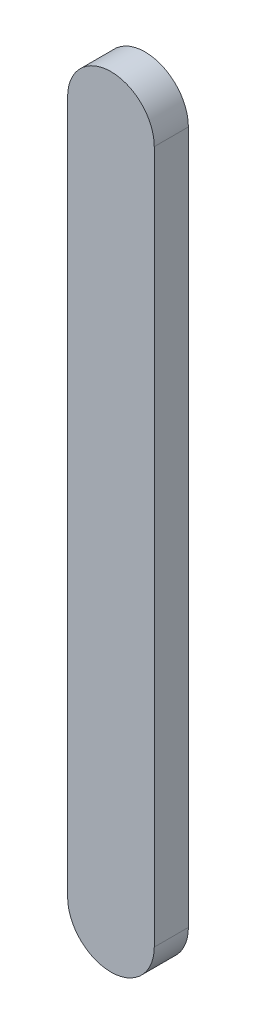
ISO-10303-21;
HEADER;
FILE_DESCRIPTION(('STEP AP214'),'2;1');
FILE_NAME('part.step','',(''),(''),'','','');
FILE_SCHEMA(('AUTOMOTIVE_DESIGN { 1 0 10303 214 1 1 1 1 }'));
ENDSEC;
DATA;
#1=APPLICATION_CONTEXT('core data for automotive mechanical design processes');
#2=APPLICATION_PROTOCOL_DEFINITION('international standard','automotive_design',2000,#1);
#3=PRODUCT_CONTEXT('',#1,'mechanical');
#4=PRODUCT('Part','Part','',(#3));
#5=PRODUCT_RELATED_PRODUCT_CATEGORY('part','',(#4));
#6=PRODUCT_DEFINITION_FORMATION('','',#4);
#7=PRODUCT_DEFINITION_CONTEXT('part definition',#1,'design');
#8=PRODUCT_DEFINITION('design','',#6,#7);
#9=PRODUCT_DEFINITION_SHAPE('','',#8);
#10=(LENGTH_UNIT() NAMED_UNIT(*) SI_UNIT(.MILLI.,.METRE.));
#11=(NAMED_UNIT(*) PLANE_ANGLE_UNIT() SI_UNIT($,.RADIAN.));
#12=(NAMED_UNIT(*) SI_UNIT($,.STERADIAN.) SOLID_ANGLE_UNIT());
#13=UNCERTAINTY_MEASURE_WITH_UNIT(LENGTH_MEASURE(1.E-05),#10,'distance_accuracy_value','');
#14=(GEOMETRIC_REPRESENTATION_CONTEXT(3) GLOBAL_UNCERTAINTY_ASSIGNED_CONTEXT((#13)) GLOBAL_UNIT_ASSIGNED_CONTEXT((#10,
#11,#12)) REPRESENTATION_CONTEXT('',''));
#15=CARTESIAN_POINT('',(0.,0.,0.));
#16=DIRECTION('',(0.,0.,1.));
#17=DIRECTION('',(1.,0.,0.));
#18=AXIS2_PLACEMENT_3D('',#15,#16,#17);
#19=CARTESIAN_POINT('',(88.519,109.474,0.));
#20=DIRECTION('',(-1.,0.,0.));
#21=DIRECTION('',(0.,1.,0.));
#22=AXIS2_PLACEMENT_3D('',#19,#20,#21);
#23=PLANE('',#22);
#24=DIRECTION('',(0.,1.,0.));
#25=VECTOR('',#24,1.);
#26=CARTESIAN_POINT('',(88.519,109.474,0.1999996));
#27=LINE('',#26,#25);
#28=CARTESIAN_POINT('',(88.519,109.474,0.1999996));
#29=VERTEX_POINT('',#28);
#30=CARTESIAN_POINT('',(88.519,113.538,0.1999996));
#31=VERTEX_POINT('',#30);
#32=EDGE_CURVE('E11',#29,#31,#27,.T.);
#33=ORIENTED_EDGE('',*,*,#32,.F.);
#34=DIRECTION('',(0.,0.,1.));
#35=VECTOR('',#34,1.);
#36=CARTESIAN_POINT('',(88.519,109.474,0.));
#37=LINE('',#36,#35);
#38=CARTESIAN_POINT('',(88.519,109.474,0.));
#39=VERTEX_POINT('',#38);
#40=EDGE_CURVE('E24',#39,#29,#37,.T.);
#41=ORIENTED_EDGE('',*,*,#40,.F.);
#42=DIRECTION('',(0.,1.,0.));
#43=VECTOR('',#42,1.);
#44=CARTESIAN_POINT('',(88.519,109.474,0.));
#45=LINE('',#44,#43);
#46=CARTESIAN_POINT('',(88.519,113.538,0.));
#47=VERTEX_POINT('',#46);
#48=EDGE_CURVE('E75',#39,#47,#45,.T.);
#49=ORIENTED_EDGE('',*,*,#48,.T.);
#50=DIRECTION('',(0.,0.,1.));
#51=VECTOR('',#50,1.);
#52=CARTESIAN_POINT('',(88.519,113.538,0.));
#53=LINE('',#52,#51);
#54=EDGE_CURVE('E37',#47,#31,#53,.T.);
#55=ORIENTED_EDGE('',*,*,#54,.T.);
#56=EDGE_LOOP('',(#33,#41,#49,#55));
#57=FACE_BOUND('',#56,.T.);
#58=ADVANCED_FACE('F17',(#57),#23,.F.);
#59=CARTESIAN_POINT('',(88.265,113.538,0.));
#60=DIRECTION('',(0.,0.,-1.));
#61=DIRECTION('',(1.,0.,0.));
#62=AXIS2_PLACEMENT_3D('',#59,#60,#61);
#63=CYLINDRICAL_SURFACE('',#62,0.254000000000005);
#64=CARTESIAN_POINT('',(88.265,113.538,0.1999996));
#65=DIRECTION('',(0.,0.,1.));
#66=DIRECTION('',(1.,0.,0.));
#67=AXIS2_PLACEMENT_3D('',#64,#65,#66);
#68=CIRCLE('',#67,0.254000000000005);
#69=CARTESIAN_POINT('',(88.011,113.538,0.1999996));
#70=VERTEX_POINT('',#69);
#71=EDGE_CURVE('E83',#31,#70,#68,.T.);
#72=ORIENTED_EDGE('',*,*,#71,.F.);
#73=ORIENTED_EDGE('',*,*,#54,.F.);
#74=CARTESIAN_POINT('',(88.265,113.538,0.));
#75=DIRECTION('',(0.,0.,1.));
#76=DIRECTION('',(1.,0.,0.));
#77=AXIS2_PLACEMENT_3D('',#74,#75,#76);
#78=CIRCLE('',#77,0.254000000000005);
#79=CARTESIAN_POINT('',(88.011,113.538,0.));
#80=VERTEX_POINT('',#79);
#81=EDGE_CURVE('E81',#47,#80,#78,.T.);
#82=ORIENTED_EDGE('',*,*,#81,.T.);
#83=DIRECTION('',(0.,0.,1.));
#84=VECTOR('',#83,1.);
#85=CARTESIAN_POINT('',(88.011,113.538,0.));
#86=LINE('',#85,#84);
#87=EDGE_CURVE('E67',#80,#70,#86,.T.);
#88=ORIENTED_EDGE('',*,*,#87,.T.);
#89=EDGE_LOOP('',(#72,#73,#82,#88));
#90=FACE_BOUND('',#89,.T.);
#91=ADVANCED_FACE('F89',(#90),#63,.T.);
#92=CARTESIAN_POINT('',(88.011,113.538,0.));
#93=DIRECTION('',(1.,0.,0.));
#94=DIRECTION('',(0.,-1.,0.));
#95=AXIS2_PLACEMENT_3D('',#92,#93,#94);
#96=PLANE('',#95);
#97=DIRECTION('',(0.,-1.,0.));
#98=VECTOR('',#97,1.);
#99=CARTESIAN_POINT('',(88.011,113.538,0.1999996));
#100=LINE('',#99,#98);
#101=CARTESIAN_POINT('',(88.011,109.474,0.1999996));
#102=VERTEX_POINT('',#101);
#103=EDGE_CURVE('E71',#70,#102,#100,.T.);
#104=ORIENTED_EDGE('',*,*,#103,.F.);
#105=ORIENTED_EDGE('',*,*,#87,.F.);
#106=DIRECTION('',(0.,-1.,0.));
#107=VECTOR('',#106,1.);
#108=CARTESIAN_POINT('',(88.011,113.538,0.));
#109=LINE('',#108,#107);
#110=CARTESIAN_POINT('',(88.011,109.474,0.));
#111=VERTEX_POINT('',#110);
#112=EDGE_CURVE('E63',#80,#111,#109,.T.);
#113=ORIENTED_EDGE('',*,*,#112,.T.);
#114=DIRECTION('',(0.,0.,1.));
#115=VECTOR('',#114,1.);
#116=CARTESIAN_POINT('',(88.011,109.474,0.));
#117=LINE('',#116,#115);
#118=EDGE_CURVE('E53',#111,#102,#117,.T.);
#119=ORIENTED_EDGE('',*,*,#118,.T.);
#120=EDGE_LOOP('',(#104,#105,#113,#119));
#121=FACE_BOUND('',#120,.T.);
#122=ADVANCED_FACE('F66',(#121),#96,.F.);
#123=CARTESIAN_POINT('',(88.265,109.474,0.));
#124=DIRECTION('',(0.,0.,-1.));
#125=DIRECTION('',(-1.,0.,0.));
#126=AXIS2_PLACEMENT_3D('',#123,#124,#125);
#127=CYLINDRICAL_SURFACE('',#126,0.254000000000005);
#128=CARTESIAN_POINT('',(88.265,109.474,0.1999996));
#129=DIRECTION('',(0.,0.,1.));
#130=DIRECTION('',(-1.,0.,0.));
#131=AXIS2_PLACEMENT_3D('',#128,#129,#130);
#132=CIRCLE('',#131,0.254000000000005);
#133=EDGE_CURVE('E59',#102,#29,#132,.T.);
#134=ORIENTED_EDGE('',*,*,#133,.F.);
#135=ORIENTED_EDGE('',*,*,#118,.F.);
#136=CARTESIAN_POINT('',(88.265,109.474,0.));
#137=DIRECTION('',(0.,0.,1.));
#138=DIRECTION('',(-1.,0.,0.));
#139=AXIS2_PLACEMENT_3D('',#136,#137,#138);
#140=CIRCLE('',#139,0.254000000000005);
#141=EDGE_CURVE('E57',#111,#39,#140,.T.);
#142=ORIENTED_EDGE('',*,*,#141,.T.);
#143=ORIENTED_EDGE('',*,*,#40,.T.);
#144=EDGE_LOOP('',(#134,#135,#142,#143));
#145=FACE_BOUND('',#144,.T.);
#146=ADVANCED_FACE('F55',(#145),#127,.T.);
#147=CARTESIAN_POINT('',(88.519,109.474,0.));
#148=DIRECTION('',(0.,0.,-1.));
#149=DIRECTION('',(-1.,0.,0.));
#150=AXIS2_PLACEMENT_3D('',#147,#148,#149);
#151=PLANE('',#150);
#152=ORIENTED_EDGE('',*,*,#141,.F.);
#153=ORIENTED_EDGE('',*,*,#112,.F.);
#154=ORIENTED_EDGE('',*,*,#81,.F.);
#155=ORIENTED_EDGE('',*,*,#48,.F.);
#156=EDGE_LOOP('',(#152,#153,#154,#155));
#157=FACE_BOUND('',#156,.T.);
#158=ADVANCED_FACE('F74',(#157),#151,.T.);
#159=CARTESIAN_POINT('',(88.519,109.474,0.1999996));
#160=DIRECTION('',(0.,0.,-1.));
#161=DIRECTION('',(-1.,0.,0.));
#162=AXIS2_PLACEMENT_3D('',#159,#160,#161);
#163=PLANE('',#162);
#164=ORIENTED_EDGE('',*,*,#32,.T.);
#165=ORIENTED_EDGE('',*,*,#71,.T.);
#166=ORIENTED_EDGE('',*,*,#103,.T.);
#167=ORIENTED_EDGE('',*,*,#133,.T.);
#168=EDGE_LOOP('',(#164,#165,#166,#167));
#169=FACE_BOUND('',#168,.T.);
#170=ADVANCED_FACE('F91',(#169),#163,.F.);
#171=CLOSED_SHELL('',(#58,#91,#122,#146,#158,#170));
#172=MANIFOLD_SOLID_BREP('B1',#171);
#173=ADVANCED_BREP_SHAPE_REPRESENTATION('',(#18,#172),#14);
#174=SHAPE_DEFINITION_REPRESENTATION(#9,#173);
ENDSEC;
END-ISO-10303-21;
